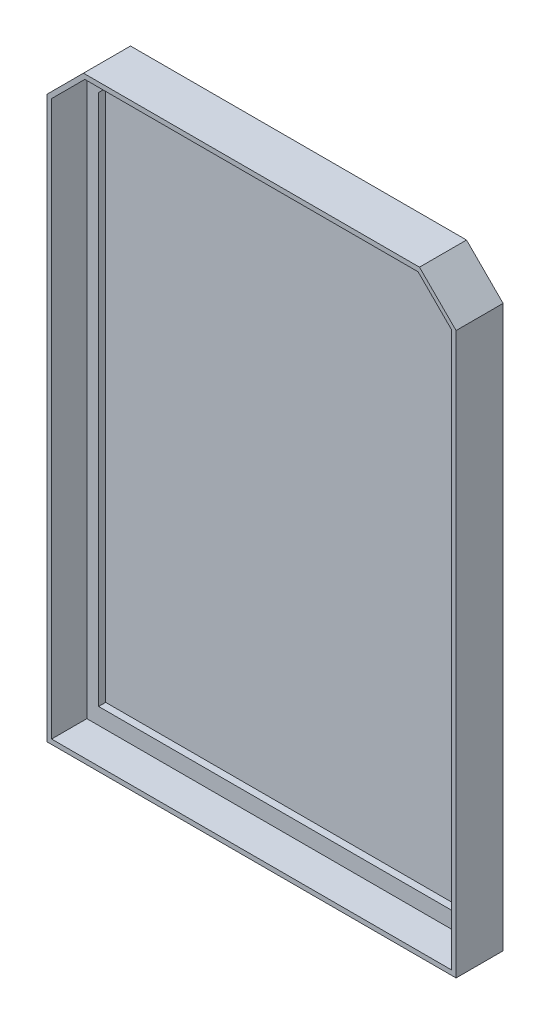
ISO-10303-21;
HEADER;
FILE_DESCRIPTION(('STEP AP214'),'2;1');
FILE_NAME('part.step','',(''),(''),'','','');
FILE_SCHEMA(('AUTOMOTIVE_DESIGN { 1 0 10303 214 1 1 1 1 }'));
ENDSEC;
DATA;
#1=APPLICATION_CONTEXT('core data for automotive mechanical design processes');
#2=APPLICATION_PROTOCOL_DEFINITION('international standard','automotive_design',2000,#1);
#3=PRODUCT_CONTEXT('',#1,'mechanical');
#4=PRODUCT('Part','Part','',(#3));
#5=PRODUCT_RELATED_PRODUCT_CATEGORY('part','',(#4));
#6=PRODUCT_DEFINITION_FORMATION('','',#4);
#7=PRODUCT_DEFINITION_CONTEXT('part definition',#1,'design');
#8=PRODUCT_DEFINITION('design','',#6,#7);
#9=PRODUCT_DEFINITION_SHAPE('','',#8);
#10=(LENGTH_UNIT() NAMED_UNIT(*) SI_UNIT(.MILLI.,.METRE.));
#11=(NAMED_UNIT(*) PLANE_ANGLE_UNIT() SI_UNIT($,.RADIAN.));
#12=(NAMED_UNIT(*) SI_UNIT($,.STERADIAN.) SOLID_ANGLE_UNIT());
#13=UNCERTAINTY_MEASURE_WITH_UNIT(LENGTH_MEASURE(1.E-05),#10,'distance_accuracy_value','');
#14=(GEOMETRIC_REPRESENTATION_CONTEXT(3) GLOBAL_UNCERTAINTY_ASSIGNED_CONTEXT((#13)) GLOBAL_UNIT_ASSIGNED_CONTEXT((#10,
#11,#12)) REPRESENTATION_CONTEXT('',''));
#15=CARTESIAN_POINT('',(0.,0.,0.));
#16=DIRECTION('',(0.,0.,1.));
#17=DIRECTION('',(1.,0.,0.));
#18=AXIS2_PLACEMENT_3D('',#15,#16,#17);
#19=CARTESIAN_POINT('',(47.0251262658472,47.0251262658468,1.5));
#20=DIRECTION('',(0.70710678118655,0.707106781186544,0.));
#21=DIRECTION('',(-0.707106781186545,0.707106781186551,0.));
#22=AXIS2_PLACEMENT_3D('',#19,#20,#21);
#23=PLANE('',#22);
#24=DIRECTION('',(0.707106781186545,-0.707106781186551,0.));
#25=VECTOR('',#24,1.);
#26=CARTESIAN_POINT('',(47.0251262658472,47.0251262658468,0.));
#27=LINE('',#26,#25);
#28=CARTESIAN_POINT('',(35.0502525316942,59.,0.));
#29=VERTEX_POINT('',#28);
#30=CARTESIAN_POINT('',(40.,54.0502525316941,0.));
#31=VERTEX_POINT('',#30);
#32=EDGE_CURVE('E171',#29,#31,#27,.T.);
#33=ORIENTED_EDGE('',*,*,#32,.T.);
#34=DIRECTION('',(0.,0.,-1.));
#35=VECTOR('',#34,1.);
#36=CARTESIAN_POINT('',(40.,54.0502525316941,1.5));
#37=LINE('',#36,#35);
#38=CARTESIAN_POINT('',(40.,54.0502525316941,1.5));
#39=VERTEX_POINT('',#38);
#40=EDGE_CURVE('E318',#39,#31,#37,.T.);
#41=ORIENTED_EDGE('',*,*,#40,.F.);
#42=DIRECTION('',(0.707106781186545,-0.707106781186551,0.));
#43=VECTOR('',#42,1.);
#44=CARTESIAN_POINT('',(47.0251262658472,47.0251262658468,1.5));
#45=LINE('',#44,#43);
#46=CARTESIAN_POINT('',(35.0502525316942,59.,1.5));
#47=VERTEX_POINT('',#46);
#48=EDGE_CURVE('E259',#47,#39,#45,.T.);
#49=ORIENTED_EDGE('',*,*,#48,.F.);
#50=DIRECTION('',(0.,0.,-1.));
#51=VECTOR('',#50,1.);
#52=CARTESIAN_POINT('',(35.0502525316942,59.,1.5));
#53=LINE('',#52,#51);
#54=EDGE_CURVE('E288',#47,#29,#53,.T.);
#55=ORIENTED_EDGE('',*,*,#54,.T.);
#56=EDGE_LOOP('',(#33,#41,#49,#55));
#57=FACE_BOUND('',#56,.T.);
#58=ADVANCED_FACE('F41',(#57),#23,.F.);
#59=CARTESIAN_POINT('',(40.,0.,1.5));
#60=DIRECTION('',(1.,0.,0.));
#61=DIRECTION('',(0.,0.,-1.));
#62=AXIS2_PLACEMENT_3D('',#59,#60,#61);
#63=PLANE('',#62);
#64=DIRECTION('',(0.,-1.,0.));
#65=VECTOR('',#64,1.);
#66=CARTESIAN_POINT('',(40.,0.,0.));
#67=LINE('',#66,#65);
#68=CARTESIAN_POINT('',(40.,-59.,0.));
#69=VERTEX_POINT('',#68);
#70=EDGE_CURVE('E291',#31,#69,#67,.T.);
#71=ORIENTED_EDGE('',*,*,#70,.T.);
#72=DIRECTION('',(0.,0.,-1.));
#73=VECTOR('',#72,1.);
#74=CARTESIAN_POINT('',(40.,-59.,1.5));
#75=LINE('',#74,#73);
#76=CARTESIAN_POINT('',(40.,-59.,1.5));
#77=VERTEX_POINT('',#76);
#78=EDGE_CURVE('E315',#77,#69,#75,.T.);
#79=ORIENTED_EDGE('',*,*,#78,.F.);
#80=DIRECTION('',(0.,-1.,0.));
#81=VECTOR('',#80,1.);
#82=CARTESIAN_POINT('',(40.,0.,1.5));
#83=LINE('',#82,#81);
#84=EDGE_CURVE('E262',#39,#77,#83,.T.);
#85=ORIENTED_EDGE('',*,*,#84,.F.);
#86=ORIENTED_EDGE('',*,*,#40,.T.);
#87=EDGE_LOOP('',(#71,#79,#85,#86));
#88=FACE_BOUND('',#87,.T.);
#89=ADVANCED_FACE('F338',(#88),#63,.F.);
#90=CARTESIAN_POINT('',(0.,-59.,1.5));
#91=DIRECTION('',(0.,-1.,0.));
#92=DIRECTION('',(0.,0.,-1.));
#93=AXIS2_PLACEMENT_3D('',#90,#91,#92);
#94=PLANE('',#93);
#95=DIRECTION('',(-1.,0.,0.));
#96=VECTOR('',#95,1.);
#97=CARTESIAN_POINT('',(0.,-59.,0.));
#98=LINE('',#97,#96);
#99=CARTESIAN_POINT('',(-40.,-59.,0.));
#100=VERTEX_POINT('',#99);
#101=EDGE_CURVE('E294',#69,#100,#98,.T.);
#102=ORIENTED_EDGE('',*,*,#101,.T.);
#103=DIRECTION('',(0.,0.,-1.));
#104=VECTOR('',#103,1.);
#105=CARTESIAN_POINT('',(-40.,-59.,1.5));
#106=LINE('',#105,#104);
#107=CARTESIAN_POINT('',(-40.,-59.,1.5));
#108=VERTEX_POINT('',#107);
#109=EDGE_CURVE('E312',#108,#100,#106,.T.);
#110=ORIENTED_EDGE('',*,*,#109,.F.);
#111=DIRECTION('',(-1.,0.,0.));
#112=VECTOR('',#111,1.);
#113=CARTESIAN_POINT('',(0.,-59.,1.5));
#114=LINE('',#113,#112);
#115=EDGE_CURVE('E265',#77,#108,#114,.T.);
#116=ORIENTED_EDGE('',*,*,#115,.F.);
#117=ORIENTED_EDGE('',*,*,#78,.T.);
#118=EDGE_LOOP('',(#102,#110,#116,#117));
#119=FACE_BOUND('',#118,.T.);
#120=ADVANCED_FACE('F344',(#119),#94,.F.);
#121=CARTESIAN_POINT('',(-40.,0.,1.5));
#122=DIRECTION('',(-1.,0.,0.));
#123=DIRECTION('',(0.,0.,1.));
#124=AXIS2_PLACEMENT_3D('',#121,#122,#123);
#125=PLANE('',#124);
#126=DIRECTION('',(0.,1.,0.));
#127=VECTOR('',#126,1.);
#128=CARTESIAN_POINT('',(-40.,0.,0.));
#129=LINE('',#128,#127);
#130=CARTESIAN_POINT('',(-40.,54.0502525316942,0.));
#131=VERTEX_POINT('',#130);
#132=EDGE_CURVE('E297',#100,#131,#129,.T.);
#133=ORIENTED_EDGE('',*,*,#132,.T.);
#134=DIRECTION('',(0.,0.,-1.));
#135=VECTOR('',#134,1.);
#136=CARTESIAN_POINT('',(-40.,54.0502525316942,1.5));
#137=LINE('',#136,#135);
#138=CARTESIAN_POINT('',(-40.,54.0502525316942,1.5));
#139=VERTEX_POINT('',#138);
#140=EDGE_CURVE('E309',#139,#131,#137,.T.);
#141=ORIENTED_EDGE('',*,*,#140,.F.);
#142=DIRECTION('',(0.,1.,0.));
#143=VECTOR('',#142,1.);
#144=CARTESIAN_POINT('',(-40.,0.,1.5));
#145=LINE('',#144,#143);
#146=EDGE_CURVE('E267',#108,#139,#145,.T.);
#147=ORIENTED_EDGE('',*,*,#146,.F.);
#148=ORIENTED_EDGE('',*,*,#109,.T.);
#149=EDGE_LOOP('',(#133,#141,#147,#148));
#150=FACE_BOUND('',#149,.T.);
#151=ADVANCED_FACE('F350',(#150),#125,.F.);
#152=CARTESIAN_POINT('',(-47.025126265847,47.0251262658472,1.5));
#153=DIRECTION('',(-0.707106781186545,0.707106781186549,0.));
#154=DIRECTION('',(-0.70710678118655,-0.707106781186546,0.));
#155=AXIS2_PLACEMENT_3D('',#152,#153,#154);
#156=PLANE('',#155);
#157=DIRECTION('',(0.70710678118655,0.707106781186546,0.));
#158=VECTOR('',#157,1.);
#159=CARTESIAN_POINT('',(-47.025126265847,47.0251262658472,0.));
#160=LINE('',#159,#158);
#161=CARTESIAN_POINT('',(-35.0502525316941,59.,0.));
#162=VERTEX_POINT('',#161);
#163=EDGE_CURVE('E300',#131,#162,#160,.T.);
#164=ORIENTED_EDGE('',*,*,#163,.T.);
#165=DIRECTION('',(0.,0.,-1.));
#166=VECTOR('',#165,1.);
#167=CARTESIAN_POINT('',(-35.0502525316941,59.,1.5));
#168=LINE('',#167,#166);
#169=CARTESIAN_POINT('',(-35.0502525316941,59.,1.5));
#170=VERTEX_POINT('',#169);
#171=EDGE_CURVE('E306',#170,#162,#168,.T.);
#172=ORIENTED_EDGE('',*,*,#171,.F.);
#173=DIRECTION('',(0.70710678118655,0.707106781186546,0.));
#174=VECTOR('',#173,1.);
#175=CARTESIAN_POINT('',(-47.025126265847,47.0251262658472,1.5));
#176=LINE('',#175,#174);
#177=EDGE_CURVE('E269',#139,#170,#176,.T.);
#178=ORIENTED_EDGE('',*,*,#177,.F.);
#179=ORIENTED_EDGE('',*,*,#140,.T.);
#180=EDGE_LOOP('',(#164,#172,#178,#179));
#181=FACE_BOUND('',#180,.T.);
#182=ADVANCED_FACE('F354',(#181),#156,.F.);
#183=CARTESIAN_POINT('',(0.,59.,1.5));
#184=DIRECTION('',(0.,-1.,0.));
#185=DIRECTION('',(1.,0.,0.));
#186=AXIS2_PLACEMENT_3D('',#183,#184,#185);
#187=PLANE('',#186);
#188=DIRECTION('',(-1.,0.,0.));
#189=VECTOR('',#188,1.);
#190=CARTESIAN_POINT('',(0.,59.,0.));
#191=LINE('',#190,#189);
#192=EDGE_CURVE('E263',#29,#162,#191,.T.);
#193=ORIENTED_EDGE('',*,*,#192,.F.);
#194=ORIENTED_EDGE('',*,*,#54,.F.);
#195=DIRECTION('',(-1.,0.,0.));
#196=VECTOR('',#195,1.);
#197=CARTESIAN_POINT('',(0.,59.,1.5));
#198=LINE('',#197,#196);
#199=EDGE_CURVE('E271',#47,#170,#198,.T.);
#200=ORIENTED_EDGE('',*,*,#199,.T.);
#201=ORIENTED_EDGE('',*,*,#171,.T.);
#202=EDGE_LOOP('',(#193,#194,#200,#201));
#203=FACE_BOUND('',#202,.T.);
#204=ADVANCED_FACE('F358',(#203),#187,.T.);
#205=CARTESIAN_POINT('',(0.,0.,1.5));
#206=DIRECTION('',(0.,0.,1.));
#207=DIRECTION('',(1.,0.,0.));
#208=AXIS2_PLACEMENT_3D('',#205,#206,#207);
#209=PLANE('',#208);
#210=ORIENTED_EDGE('',*,*,#48,.T.);
#211=ORIENTED_EDGE('',*,*,#84,.T.);
#212=ORIENTED_EDGE('',*,*,#115,.T.);
#213=ORIENTED_EDGE('',*,*,#146,.T.);
#214=ORIENTED_EDGE('',*,*,#177,.T.);
#215=ORIENTED_EDGE('',*,*,#199,.F.);
#216=EDGE_LOOP('',(#210,#211,#212,#213,#214,#215));
#217=FACE_BOUND('',#216,.T.);
#218=DIRECTION('',(0.707106781186548,0.707106781186547,0.));
#219=VECTOR('',#218,1.);
#220=CARTESIAN_POINT('',(-48.9644660940672,48.9644660940673,1.5));
#221=LINE('',#220,#219);
#222=CARTESIAN_POINT('',(-42.5,55.4289321881345,1.5));
#223=VERTEX_POINT('',#222);
#224=CARTESIAN_POINT('',(-35.4289321881345,62.5,1.5));
#225=VERTEX_POINT('',#224);
#226=EDGE_CURVE('E274',#223,#225,#221,.T.);
#227=ORIENTED_EDGE('',*,*,#226,.F.);
#228=DIRECTION('',(0.,-1.,0.));
#229=VECTOR('',#228,1.);
#230=CARTESIAN_POINT('',(-42.5,0.,1.5));
#231=LINE('',#230,#229);
#232=CARTESIAN_POINT('',(-42.5,-62.5,1.5));
#233=VERTEX_POINT('',#232);
#234=EDGE_CURVE('E276',#223,#233,#231,.T.);
#235=ORIENTED_EDGE('',*,*,#234,.T.);
#236=DIRECTION('',(-1.,0.,0.));
#237=VECTOR('',#236,1.);
#238=CARTESIAN_POINT('',(0.,-62.5,1.5));
#239=LINE('',#238,#237);
#240=CARTESIAN_POINT('',(42.5,-62.5,1.5));
#241=VERTEX_POINT('',#240);
#242=EDGE_CURVE('E278',#241,#233,#239,.T.);
#243=ORIENTED_EDGE('',*,*,#242,.F.);
#244=DIRECTION('',(0.,-1.,0.));
#245=VECTOR('',#244,1.);
#246=CARTESIAN_POINT('',(42.5,0.,1.5));
#247=LINE('',#246,#245);
#248=CARTESIAN_POINT('',(42.5,55.4289321881345,1.5));
#249=VERTEX_POINT('',#248);
#250=EDGE_CURVE('E281',#249,#241,#247,.T.);
#251=ORIENTED_EDGE('',*,*,#250,.F.);
#252=DIRECTION('',(0.707106781186546,-0.70710678118655,0.));
#253=VECTOR('',#252,1.);
#254=CARTESIAN_POINT('',(48.9644660940674,48.9644660940671,1.5));
#255=LINE('',#254,#253);
#256=CARTESIAN_POINT('',(35.4289321881346,62.5,1.5));
#257=VERTEX_POINT('',#256);
#258=EDGE_CURVE('E284',#257,#249,#255,.T.);
#259=ORIENTED_EDGE('',*,*,#258,.F.);
#260=DIRECTION('',(-1.,0.,0.));
#261=VECTOR('',#260,1.);
#262=CARTESIAN_POINT('',(0.,62.5,1.5));
#263=LINE('',#262,#261);
#264=EDGE_CURVE('E57',#257,#225,#263,.T.);
#265=ORIENTED_EDGE('',*,*,#264,.T.);
#266=EDGE_LOOP('',(#227,#235,#243,#251,#259,#265));
#267=FACE_BOUND('',#266,.T.);
#268=ADVANCED_FACE('F362',(#217,#267),#209,.T.);
#269=CARTESIAN_POINT('',(0.,-63.5,9.));
#270=DIRECTION('',(0.,1.,0.));
#271=DIRECTION('',(0.,0.,1.));
#272=AXIS2_PLACEMENT_3D('',#269,#270,#271);
#273=PLANE('',#272);
#274=DIRECTION('',(0.,0.,-1.));
#275=VECTOR('',#274,1.);
#276=CARTESIAN_POINT('',(-43.5,-63.5,9.));
#277=LINE('',#276,#275);
#278=CARTESIAN_POINT('',(-43.5,-63.5,9.));
#279=VERTEX_POINT('',#278);
#280=CARTESIAN_POINT('',(-43.5,-63.5,-1.));
#281=VERTEX_POINT('',#280);
#282=EDGE_CURVE('E187',#279,#281,#277,.T.);
#283=ORIENTED_EDGE('',*,*,#282,.T.);
#284=DIRECTION('',(1.,0.,0.));
#285=VECTOR('',#284,1.);
#286=CARTESIAN_POINT('',(0.,-63.5,-1.));
#287=LINE('',#286,#285);
#288=CARTESIAN_POINT('',(43.5,-63.5,-1.));
#289=VERTEX_POINT('',#288);
#290=EDGE_CURVE('E179',#281,#289,#287,.T.);
#291=ORIENTED_EDGE('',*,*,#290,.T.);
#292=DIRECTION('',(0.,0.,-1.));
#293=VECTOR('',#292,1.);
#294=CARTESIAN_POINT('',(43.5,-63.5,9.));
#295=LINE('',#294,#293);
#296=CARTESIAN_POINT('',(43.5,-63.5,9.));
#297=VERTEX_POINT('',#296);
#298=EDGE_CURVE('E161',#297,#289,#295,.T.);
#299=ORIENTED_EDGE('',*,*,#298,.F.);
#300=DIRECTION('',(1.,0.,0.));
#301=VECTOR('',#300,1.);
#302=CARTESIAN_POINT('',(0.,-63.5,9.));
#303=LINE('',#302,#301);
#304=EDGE_CURVE('E222',#279,#297,#303,.T.);
#305=ORIENTED_EDGE('',*,*,#304,.F.);
#306=EDGE_LOOP('',(#283,#291,#299,#305));
#307=FACE_BOUND('',#306,.T.);
#308=ADVANCED_FACE('F185',(#307),#273,.F.);
#309=CARTESIAN_POINT('',(43.5,0.,9.));
#310=DIRECTION('',(-1.,0.,0.));
#311=DIRECTION('',(0.,0.,1.));
#312=AXIS2_PLACEMENT_3D('',#309,#310,#311);
#313=PLANE('',#312);
#314=ORIENTED_EDGE('',*,*,#298,.T.);
#315=DIRECTION('',(0.,1.,0.));
#316=VECTOR('',#315,1.);
#317=CARTESIAN_POINT('',(43.5,0.,-1.));
#318=LINE('',#317,#316);
#319=CARTESIAN_POINT('',(43.5,55.721825406948,-1.));
#320=VERTEX_POINT('',#319);
#321=EDGE_CURVE('E165',#289,#320,#318,.T.);
#322=ORIENTED_EDGE('',*,*,#321,.T.);
#323=DIRECTION('',(0.,0.,-1.));
#324=VECTOR('',#323,1.);
#325=CARTESIAN_POINT('',(43.5,55.721825406948,9.));
#326=LINE('',#325,#324);
#327=CARTESIAN_POINT('',(43.5,55.721825406948,9.));
#328=VERTEX_POINT('',#327);
#329=EDGE_CURVE('E172',#328,#320,#326,.T.);
#330=ORIENTED_EDGE('',*,*,#329,.F.);
#331=DIRECTION('',(0.,1.,0.));
#332=VECTOR('',#331,1.);
#333=CARTESIAN_POINT('',(43.5,0.,9.));
#334=LINE('',#333,#332);
#335=EDGE_CURVE('E166',#297,#328,#334,.T.);
#336=ORIENTED_EDGE('',*,*,#335,.F.);
#337=EDGE_LOOP('',(#314,#322,#330,#336));
#338=FACE_BOUND('',#337,.T.);
#339=ADVANCED_FACE('F163',(#338),#313,.F.);
#340=CARTESIAN_POINT('',(49.610912703474,49.610912703474,9.));
#341=DIRECTION('',(-0.707106781186547,-0.707106781186547,0.));
#342=DIRECTION('',(0.707106781186548,-0.707106781186548,0.));
#343=AXIS2_PLACEMENT_3D('',#340,#341,#342);
#344=PLANE('',#343);
#345=ORIENTED_EDGE('',*,*,#329,.T.);
#346=DIRECTION('',(-0.707106781186548,0.707106781186548,0.));
#347=VECTOR('',#346,1.);
#348=CARTESIAN_POINT('',(49.610912703474,49.610912703474,-1.));
#349=LINE('',#348,#347);
#350=CARTESIAN_POINT('',(35.721825406948,63.5,-1.));
#351=VERTEX_POINT('',#350);
#352=EDGE_CURVE('E183',#320,#351,#349,.T.);
#353=ORIENTED_EDGE('',*,*,#352,.T.);
#354=DIRECTION('',(0.,0.,-1.));
#355=VECTOR('',#354,1.);
#356=CARTESIAN_POINT('',(35.721825406948,63.5,9.));
#357=LINE('',#356,#355);
#358=CARTESIAN_POINT('',(35.721825406948,63.5,9.));
#359=VERTEX_POINT('',#358);
#360=EDGE_CURVE('E240',#359,#351,#357,.T.);
#361=ORIENTED_EDGE('',*,*,#360,.F.);
#362=DIRECTION('',(-0.707106781186548,0.707106781186548,0.));
#363=VECTOR('',#362,1.);
#364=CARTESIAN_POINT('',(49.610912703474,49.610912703474,9.));
#365=LINE('',#364,#363);
#366=EDGE_CURVE('E225',#328,#359,#365,.T.);
#367=ORIENTED_EDGE('',*,*,#366,.F.);
#368=EDGE_LOOP('',(#345,#353,#361,#367));
#369=FACE_BOUND('',#368,.T.);
#370=ADVANCED_FACE('F397',(#369),#344,.F.);
#371=CARTESIAN_POINT('',(0.,63.5,9.));
#372=DIRECTION('',(0.,-1.,0.));
#373=DIRECTION('',(0.,0.,-1.));
#374=AXIS2_PLACEMENT_3D('',#371,#372,#373);
#375=PLANE('',#374);
#376=ORIENTED_EDGE('',*,*,#360,.T.);
#377=DIRECTION('',(-1.,0.,0.));
#378=VECTOR('',#377,1.);
#379=CARTESIAN_POINT('',(0.,63.5,-1.));
#380=LINE('',#379,#378);
#381=CARTESIAN_POINT('',(-35.721825406948,63.5,-1.));
#382=VERTEX_POINT('',#381);
#383=EDGE_CURVE('E196',#351,#382,#380,.T.);
#384=ORIENTED_EDGE('',*,*,#383,.T.);
#385=DIRECTION('',(0.,0.,-1.));
#386=VECTOR('',#385,1.);
#387=CARTESIAN_POINT('',(-35.721825406948,63.5,9.));
#388=LINE('',#387,#386);
#389=CARTESIAN_POINT('',(-35.721825406948,63.5,9.));
#390=VERTEX_POINT('',#389);
#391=EDGE_CURVE('E238',#390,#382,#388,.T.);
#392=ORIENTED_EDGE('',*,*,#391,.F.);
#393=DIRECTION('',(-1.,0.,0.));
#394=VECTOR('',#393,1.);
#395=CARTESIAN_POINT('',(0.,63.5,9.));
#396=LINE('',#395,#394);
#397=EDGE_CURVE('E227',#359,#390,#396,.T.);
#398=ORIENTED_EDGE('',*,*,#397,.F.);
#399=EDGE_LOOP('',(#376,#384,#392,#398));
#400=FACE_BOUND('',#399,.T.);
#401=ADVANCED_FACE('F400',(#400),#375,.F.);
#402=CARTESIAN_POINT('',(-49.6109127034739,49.6109127034742,9.));
#403=DIRECTION('',(0.707106781186545,-0.70710678118655,0.));
#404=DIRECTION('',(0.70710678118655,0.707106781186545,0.));
#405=AXIS2_PLACEMENT_3D('',#402,#403,#404);
#406=PLANE('',#405);
#407=ORIENTED_EDGE('',*,*,#391,.T.);
#408=DIRECTION('',(-0.70710678118655,-0.707106781186545,0.));
#409=VECTOR('',#408,1.);
#410=CARTESIAN_POINT('',(-49.6109127034739,49.6109127034742,-1.));
#411=LINE('',#410,#409);
#412=CARTESIAN_POINT('',(-43.5,55.721825406948,-1.));
#413=VERTEX_POINT('',#412);
#414=EDGE_CURVE('E199',#382,#413,#411,.T.);
#415=ORIENTED_EDGE('',*,*,#414,.T.);
#416=DIRECTION('',(0.,0.,-1.));
#417=VECTOR('',#416,1.);
#418=CARTESIAN_POINT('',(-43.5,55.721825406948,9.));
#419=LINE('',#418,#417);
#420=CARTESIAN_POINT('',(-43.5,55.721825406948,9.));
#421=VERTEX_POINT('',#420);
#422=EDGE_CURVE('E235',#421,#413,#419,.T.);
#423=ORIENTED_EDGE('',*,*,#422,.F.);
#424=DIRECTION('',(-0.70710678118655,-0.707106781186545,0.));
#425=VECTOR('',#424,1.);
#426=CARTESIAN_POINT('',(-49.6109127034739,49.6109127034742,9.));
#427=LINE('',#426,#425);
#428=EDGE_CURVE('E229',#390,#421,#427,.T.);
#429=ORIENTED_EDGE('',*,*,#428,.F.);
#430=EDGE_LOOP('',(#407,#415,#423,#429));
#431=FACE_BOUND('',#430,.T.);
#432=ADVANCED_FACE('F371',(#431),#406,.F.);
#433=CARTESIAN_POINT('',(42.5,0.,9.));
#434=DIRECTION('',(-1.,0.,0.));
#435=DIRECTION('',(0.,0.,1.));
#436=AXIS2_PLACEMENT_3D('',#433,#434,#435);
#437=PLANE('',#436);
#438=DIRECTION('',(0.,0.,-1.));
#439=VECTOR('',#438,1.);
#440=CARTESIAN_POINT('',(42.5,55.4289321881345,9.));
#441=LINE('',#440,#439);
#442=CARTESIAN_POINT('',(42.5,55.4289321881345,9.));
#443=VERTEX_POINT('',#442);
#444=EDGE_CURVE('E233',#443,#249,#441,.T.);
#445=ORIENTED_EDGE('',*,*,#444,.T.);
#446=ORIENTED_EDGE('',*,*,#250,.T.);
#447=DIRECTION('',(0.,0.,-1.));
#448=VECTOR('',#447,1.);
#449=CARTESIAN_POINT('',(42.5,-62.5,9.));
#450=LINE('',#449,#448);
#451=CARTESIAN_POINT('',(42.5,-62.5,9.));
#452=VERTEX_POINT('',#451);
#453=EDGE_CURVE('E236',#452,#241,#450,.T.);
#454=ORIENTED_EDGE('',*,*,#453,.F.);
#455=DIRECTION('',(0.,1.,0.));
#456=VECTOR('',#455,1.);
#457=CARTESIAN_POINT('',(42.5,0.,9.));
#458=LINE('',#457,#456);
#459=EDGE_CURVE('E204',#452,#443,#458,.T.);
#460=ORIENTED_EDGE('',*,*,#459,.T.);
#461=EDGE_LOOP('',(#445,#446,#454,#460));
#462=FACE_BOUND('',#461,.T.);
#463=ADVANCED_FACE('F367',(#462),#437,.T.);
#464=CARTESIAN_POINT('',(0.,-62.5,9.));
#465=DIRECTION('',(0.,1.,0.));
#466=DIRECTION('',(0.,0.,1.));
#467=AXIS2_PLACEMENT_3D('',#464,#465,#466);
#468=PLANE('',#467);
#469=ORIENTED_EDGE('',*,*,#453,.T.);
#470=ORIENTED_EDGE('',*,*,#242,.T.);
#471=DIRECTION('',(0.,0.,-1.));
#472=VECTOR('',#471,1.);
#473=CARTESIAN_POINT('',(-42.5,-62.5,9.));
#474=LINE('',#473,#472);
#475=CARTESIAN_POINT('',(-42.5,-62.5,9.));
#476=VERTEX_POINT('',#475);
#477=EDGE_CURVE('E254',#476,#233,#474,.T.);
#478=ORIENTED_EDGE('',*,*,#477,.F.);
#479=DIRECTION('',(1.,0.,0.));
#480=VECTOR('',#479,1.);
#481=CARTESIAN_POINT('',(0.,-62.5,9.));
#482=LINE('',#481,#480);
#483=EDGE_CURVE('E207',#476,#452,#482,.T.);
#484=ORIENTED_EDGE('',*,*,#483,.T.);
#485=EDGE_LOOP('',(#469,#470,#478,#484));
#486=FACE_BOUND('',#485,.T.);
#487=ADVANCED_FACE('F370',(#486),#468,.T.);
#488=CARTESIAN_POINT('',(-42.5,0.,9.));
#489=DIRECTION('',(1.,0.,0.));
#490=DIRECTION('',(0.,0.,-1.));
#491=AXIS2_PLACEMENT_3D('',#488,#489,#490);
#492=PLANE('',#491);
#493=ORIENTED_EDGE('',*,*,#477,.T.);
#494=ORIENTED_EDGE('',*,*,#234,.F.);
#495=DIRECTION('',(0.,0.,-1.));
#496=VECTOR('',#495,1.);
#497=CARTESIAN_POINT('',(-42.5,55.4289321881345,9.));
#498=LINE('',#497,#496);
#499=CARTESIAN_POINT('',(-42.5,55.4289321881345,9.));
#500=VERTEX_POINT('',#499);
#501=EDGE_CURVE('E251',#500,#223,#498,.T.);
#502=ORIENTED_EDGE('',*,*,#501,.F.);
#503=DIRECTION('',(0.,-1.,0.));
#504=VECTOR('',#503,1.);
#505=CARTESIAN_POINT('',(-42.5,0.,9.));
#506=LINE('',#505,#504);
#507=EDGE_CURVE('E210',#500,#476,#506,.T.);
#508=ORIENTED_EDGE('',*,*,#507,.T.);
#509=EDGE_LOOP('',(#493,#494,#502,#508));
#510=FACE_BOUND('',#509,.T.);
#511=ADVANCED_FACE('F375',(#510),#492,.T.);
#512=CARTESIAN_POINT('',(-48.9644660940672,48.9644660940673,9.));
#513=DIRECTION('',(0.707106781186547,-0.707106781186548,0.));
#514=DIRECTION('',(0.707106781186548,0.707106781186547,0.));
#515=AXIS2_PLACEMENT_3D('',#512,#513,#514);
#516=PLANE('',#515);
#517=ORIENTED_EDGE('',*,*,#501,.T.);
#518=ORIENTED_EDGE('',*,*,#226,.T.);
#519=DIRECTION('',(0.,0.,-1.));
#520=VECTOR('',#519,1.);
#521=CARTESIAN_POINT('',(-35.4289321881345,62.5,9.));
#522=LINE('',#521,#520);
#523=CARTESIAN_POINT('',(-35.4289321881345,62.5,9.));
#524=VERTEX_POINT('',#523);
#525=EDGE_CURVE('E248',#524,#225,#522,.T.);
#526=ORIENTED_EDGE('',*,*,#525,.F.);
#527=DIRECTION('',(-0.707106781186548,-0.707106781186547,0.));
#528=VECTOR('',#527,1.);
#529=CARTESIAN_POINT('',(-48.9644660940672,48.9644660940673,9.));
#530=LINE('',#529,#528);
#531=EDGE_CURVE('E213',#524,#500,#530,.T.);
#532=ORIENTED_EDGE('',*,*,#531,.T.);
#533=EDGE_LOOP('',(#517,#518,#526,#532));
#534=FACE_BOUND('',#533,.T.);
#535=ADVANCED_FACE('F379',(#534),#516,.T.);
#536=CARTESIAN_POINT('',(0.,62.5,9.));
#537=DIRECTION('',(0.,-1.,0.));
#538=DIRECTION('',(0.,0.,-1.));
#539=AXIS2_PLACEMENT_3D('',#536,#537,#538);
#540=PLANE('',#539);
#541=ORIENTED_EDGE('',*,*,#525,.T.);
#542=ORIENTED_EDGE('',*,*,#264,.F.);
#543=DIRECTION('',(0.,0.,-1.));
#544=VECTOR('',#543,1.);
#545=CARTESIAN_POINT('',(35.4289321881346,62.5,9.));
#546=LINE('',#545,#544);
#547=CARTESIAN_POINT('',(35.4289321881346,62.5,9.));
#548=VERTEX_POINT('',#547);
#549=EDGE_CURVE('E245',#548,#257,#546,.T.);
#550=ORIENTED_EDGE('',*,*,#549,.F.);
#551=DIRECTION('',(-1.,0.,0.));
#552=VECTOR('',#551,1.);
#553=CARTESIAN_POINT('',(0.,62.5,9.));
#554=LINE('',#553,#552);
#555=EDGE_CURVE('E216',#548,#524,#554,.T.);
#556=ORIENTED_EDGE('',*,*,#555,.T.);
#557=EDGE_LOOP('',(#541,#542,#550,#556));
#558=FACE_BOUND('',#557,.T.);
#559=ADVANCED_FACE('F383',(#558),#540,.T.);
#560=CARTESIAN_POINT('',(48.9644660940674,48.9644660940671,9.));
#561=DIRECTION('',(-0.707106781186549,-0.707106781186545,0.));
#562=DIRECTION('',(0.707106781186546,-0.70710678118655,0.));
#563=AXIS2_PLACEMENT_3D('',#560,#561,#562);
#564=PLANE('',#563);
#565=ORIENTED_EDGE('',*,*,#549,.T.);
#566=ORIENTED_EDGE('',*,*,#258,.T.);
#567=ORIENTED_EDGE('',*,*,#444,.F.);
#568=DIRECTION('',(-0.707106781186546,0.70710678118655,0.));
#569=VECTOR('',#568,1.);
#570=CARTESIAN_POINT('',(48.9644660940674,48.9644660940671,9.));
#571=LINE('',#570,#569);
#572=EDGE_CURVE('E219',#443,#548,#571,.T.);
#573=ORIENTED_EDGE('',*,*,#572,.T.);
#574=EDGE_LOOP('',(#565,#566,#567,#573));
#575=FACE_BOUND('',#574,.T.);
#576=ADVANCED_FACE('F387',(#575),#564,.T.);
#577=CARTESIAN_POINT('',(-43.5,0.,9.));
#578=DIRECTION('',(1.,0.,0.));
#579=DIRECTION('',(0.,0.,-1.));
#580=AXIS2_PLACEMENT_3D('',#577,#578,#579);
#581=PLANE('',#580);
#582=ORIENTED_EDGE('',*,*,#422,.T.);
#583=DIRECTION('',(0.,-1.,0.));
#584=VECTOR('',#583,1.);
#585=CARTESIAN_POINT('',(-43.5,0.,-1.));
#586=LINE('',#585,#584);
#587=EDGE_CURVE('E202',#413,#281,#586,.T.);
#588=ORIENTED_EDGE('',*,*,#587,.T.);
#589=ORIENTED_EDGE('',*,*,#282,.F.);
#590=DIRECTION('',(0.,-1.,0.));
#591=VECTOR('',#590,1.);
#592=CARTESIAN_POINT('',(-43.5,0.,9.));
#593=LINE('',#592,#591);
#594=EDGE_CURVE('E231',#421,#279,#593,.T.);
#595=ORIENTED_EDGE('',*,*,#594,.F.);
#596=EDGE_LOOP('',(#582,#588,#589,#595));
#597=FACE_BOUND('',#596,.T.);
#598=ADVANCED_FACE('F391',(#597),#581,.F.);
#599=CARTESIAN_POINT('',(0.,0.,9.));
#600=DIRECTION('',(0.,0.,1.));
#601=DIRECTION('',(1.,0.,0.));
#602=AXIS2_PLACEMENT_3D('',#599,#600,#601);
#603=PLANE('',#602);
#604=ORIENTED_EDGE('',*,*,#459,.F.);
#605=ORIENTED_EDGE('',*,*,#483,.F.);
#606=ORIENTED_EDGE('',*,*,#507,.F.);
#607=ORIENTED_EDGE('',*,*,#531,.F.);
#608=ORIENTED_EDGE('',*,*,#555,.F.);
#609=ORIENTED_EDGE('',*,*,#572,.F.);
#610=EDGE_LOOP('',(#604,#605,#606,#607,#608,#609));
#611=FACE_BOUND('',#610,.T.);
#612=ORIENTED_EDGE('',*,*,#304,.T.);
#613=ORIENTED_EDGE('',*,*,#335,.T.);
#614=ORIENTED_EDGE('',*,*,#366,.T.);
#615=ORIENTED_EDGE('',*,*,#397,.T.);
#616=ORIENTED_EDGE('',*,*,#428,.T.);
#617=ORIENTED_EDGE('',*,*,#594,.T.);
#618=EDGE_LOOP('',(#612,#613,#614,#615,#616,#617));
#619=FACE_BOUND('',#618,.T.);
#620=ADVANCED_FACE('F410',(#611,#619),#603,.T.);
#621=CARTESIAN_POINT('',(0.,0.,0.));
#622=DIRECTION('',(0.,0.,1.));
#623=DIRECTION('',(1.,0.,0.));
#624=AXIS2_PLACEMENT_3D('',#621,#622,#623);
#625=PLANE('',#624);
#626=ORIENTED_EDGE('',*,*,#32,.F.);
#627=ORIENTED_EDGE('',*,*,#192,.T.);
#628=ORIENTED_EDGE('',*,*,#163,.F.);
#629=ORIENTED_EDGE('',*,*,#132,.F.);
#630=ORIENTED_EDGE('',*,*,#101,.F.);
#631=ORIENTED_EDGE('',*,*,#70,.F.);
#632=EDGE_LOOP('',(#626,#627,#628,#629,#630,#631));
#633=FACE_BOUND('',#632,.T.);
#634=ADVANCED_FACE('F413',(#633),#625,.T.);
#635=CARTESIAN_POINT('',(0.,0.,-1.));
#636=DIRECTION('',(0.,0.,1.));
#637=DIRECTION('',(1.,0.,0.));
#638=AXIS2_PLACEMENT_3D('',#635,#636,#637);
#639=PLANE('',#638);
#640=CARTESIAN_POINT('',(0.,0.,-1.));
#641=DIRECTION('',(0.,0.,1.));
#642=DIRECTION('',(1.,0.,0.));
#643=AXIS2_PLACEMENT_3D('',#640,#641,#642);
#644=CIRCLE('',#643,26.);
#645=CARTESIAN_POINT('',(26.,0.,-1.));
#646=VERTEX_POINT('',#645);
#647=EDGE_CURVE('E11',#646,#646,#644,.T.);
#648=ORIENTED_EDGE('',*,*,#647,.T.);
#649=EDGE_LOOP('',(#648));
#650=FACE_BOUND('',#649,.T.);
#651=ORIENTED_EDGE('',*,*,#290,.F.);
#652=ORIENTED_EDGE('',*,*,#587,.F.);
#653=ORIENTED_EDGE('',*,*,#414,.F.);
#654=ORIENTED_EDGE('',*,*,#383,.F.);
#655=ORIENTED_EDGE('',*,*,#352,.F.);
#656=ORIENTED_EDGE('',*,*,#321,.F.);
#657=EDGE_LOOP('',(#651,#652,#653,#654,#655,#656));
#658=FACE_BOUND('',#657,.T.);
#659=ADVANCED_FACE('F177',(#650,#658),#639,.F.);
#660=CARTESIAN_POINT('',(0.,0.,-31.));
#661=DIRECTION('',(0.,0.,-1.));
#662=DIRECTION('',(-1.,0.,0.));
#663=AXIS2_PLACEMENT_3D('',#660,#661,#662);
#664=PLANE('',#663);
#665=CARTESIAN_POINT('',(0.,0.,-31.));
#666=DIRECTION('',(0.,0.,-1.));
#667=DIRECTION('',(-1.,0.,0.));
#668=AXIS2_PLACEMENT_3D('',#665,#666,#667);
#669=CIRCLE('',#668,6.);
#670=CARTESIAN_POINT('',(-6.,0.,-31.));
#671=VERTEX_POINT('',#670);
#672=EDGE_CURVE('E188',#671,#671,#669,.T.);
#673=ORIENTED_EDGE('',*,*,#672,.T.);
#674=EDGE_LOOP('',(#673));
#675=FACE_BOUND('',#674,.T.);
#676=CARTESIAN_POINT('',(0.,0.,-31.));
#677=DIRECTION('',(0.,0.,-1.));
#678=DIRECTION('',(-1.,0.,0.));
#679=AXIS2_PLACEMENT_3D('',#676,#677,#678);
#680=CIRCLE('',#679,4.25);
#681=CARTESIAN_POINT('',(-4.25,0.,-31.));
#682=VERTEX_POINT('',#681);
#683=EDGE_CURVE('E191',#682,#682,#680,.T.);
#684=ORIENTED_EDGE('',*,*,#683,.F.);
#685=EDGE_LOOP('',(#684));
#686=FACE_BOUND('',#685,.T.);
#687=ADVANCED_FACE('F419',(#675,#686),#664,.T.);
#688=CARTESIAN_POINT('',(0.,0.,-31.));
#689=DIRECTION('',(0.,0.,1.));
#690=DIRECTION('',(1.,0.,0.));
#691=AXIS2_PLACEMENT_3D('',#688,#689,#690);
#692=CYLINDRICAL_SURFACE('',#691,6.);
#693=CARTESIAN_POINT('',(0.,0.,-21.));
#694=DIRECTION('',(0.,0.,1.));
#695=DIRECTION('',(1.,0.,0.));
#696=AXIS2_PLACEMENT_3D('',#693,#694,#695);
#697=CIRCLE('',#696,6.);
#698=CARTESIAN_POINT('',(6.,0.,-21.));
#699=VERTEX_POINT('',#698);
#700=EDGE_CURVE('E50',#699,#699,#697,.F.);
#701=ORIENTED_EDGE('',*,*,#700,.T.);
#702=EDGE_LOOP('',(#701));
#703=FACE_BOUND('',#702,.T.);
#704=ORIENTED_EDGE('',*,*,#672,.F.);
#705=EDGE_LOOP('',(#704));
#706=FACE_BOUND('',#705,.T.);
#707=ADVANCED_FACE('F323',(#703,#706),#692,.T.);
#708=CARTESIAN_POINT('',(0.,0.,-31.));
#709=DIRECTION('',(0.,0.,1.));
#710=DIRECTION('',(1.,0.,0.));
#711=AXIS2_PLACEMENT_3D('',#708,#709,#710);
#712=CYLINDRICAL_SURFACE('',#711,4.25);
#713=ORIENTED_EDGE('',*,*,#683,.T.);
#714=EDGE_LOOP('',(#713));
#715=FACE_BOUND('',#714,.T.);
#716=CARTESIAN_POINT('',(0.,0.,-1.));
#717=DIRECTION('',(0.,0.,-1.));
#718=DIRECTION('',(-1.,0.,0.));
#719=AXIS2_PLACEMENT_3D('',#716,#717,#718);
#720=CIRCLE('',#719,4.25);
#721=CARTESIAN_POINT('',(-4.25,0.,-1.));
#722=VERTEX_POINT('',#721);
#723=EDGE_CURVE('E434',#722,#722,#720,.T.);
#724=ORIENTED_EDGE('',*,*,#723,.F.);
#725=EDGE_LOOP('',(#724));
#726=FACE_BOUND('',#725,.T.);
#727=ADVANCED_FACE('F333',(#715,#726),#712,.F.);
#728=ORIENTED_EDGE('',*,*,#723,.T.);
#729=EDGE_LOOP('',(#728));
#730=FACE_BOUND('',#729,.T.);
#731=ADVANCED_FACE('F327',(#730),#639,.F.);
#732=CARTESIAN_POINT('',(0.,0.,-21.));
#733=DIRECTION('',(0.,0.,1.));
#734=DIRECTION('',(1.,0.,0.));
#735=AXIS2_PLACEMENT_3D('',#732,#733,#734);
#736=TOROIDAL_SURFACE('',#735,26.,20.);
#737=ORIENTED_EDGE('',*,*,#647,.F.);
#738=EDGE_LOOP('',(#737));
#739=FACE_BOUND('',#738,.T.);
#740=ORIENTED_EDGE('',*,*,#700,.F.);
#741=EDGE_LOOP('',(#740));
#742=FACE_BOUND('',#741,.T.);
#743=ADVANCED_FACE('F43',(#739,#742),#736,.F.);
#744=CLOSED_SHELL('',(#58,#89,#120,#151,#182,#204,#268,#308,#339,#370,#401,#432,#463,#487,#511,
#535,#559,#576,#598,#620,#634,#659,#687,#707,#727,#731,#743));
#745=MANIFOLD_SOLID_BREP('B2',#744);
#746=ADVANCED_BREP_SHAPE_REPRESENTATION('',(#18,#745),#14);
#747=SHAPE_DEFINITION_REPRESENTATION(#9,#746);
ENDSEC;
END-ISO-10303-21;
